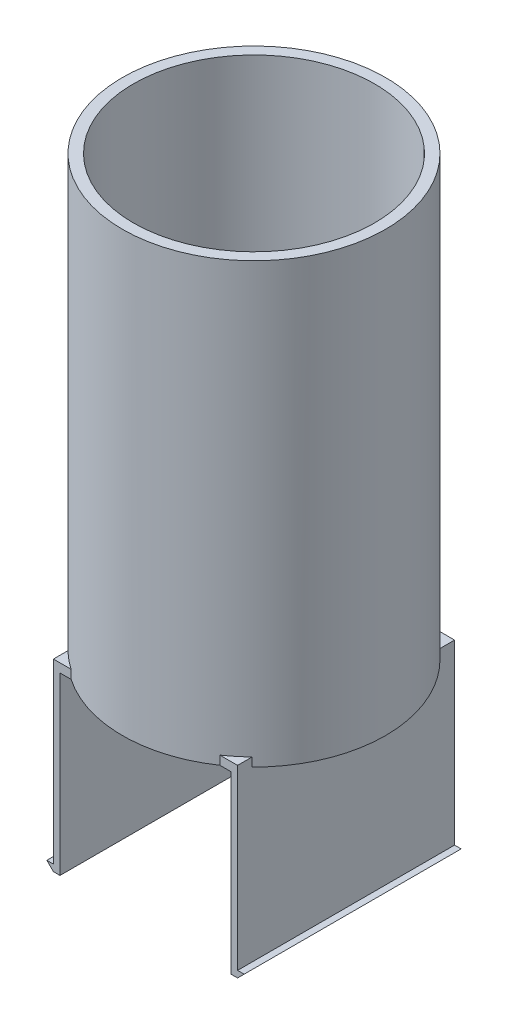
ISO-10303-21;
HEADER;
FILE_DESCRIPTION(('STEP AP214'),'2;1');
FILE_NAME('part.step','',(''),(''),'','','');
FILE_SCHEMA(('AUTOMOTIVE_DESIGN { 1 0 10303 214 1 1 1 1 }'));
ENDSEC;
DATA;
#1=APPLICATION_CONTEXT('core data for automotive mechanical design processes');
#2=APPLICATION_PROTOCOL_DEFINITION('international standard','automotive_design',2000,#1);
#3=PRODUCT_CONTEXT('',#1,'mechanical');
#4=PRODUCT('Part','Part','',(#3));
#5=PRODUCT_RELATED_PRODUCT_CATEGORY('part','',(#4));
#6=PRODUCT_DEFINITION_FORMATION('','',#4);
#7=PRODUCT_DEFINITION_CONTEXT('part definition',#1,'design');
#8=PRODUCT_DEFINITION('design','',#6,#7);
#9=PRODUCT_DEFINITION_SHAPE('','',#8);
#10=(LENGTH_UNIT() NAMED_UNIT(*) SI_UNIT(.MILLI.,.METRE.));
#11=(NAMED_UNIT(*) PLANE_ANGLE_UNIT() SI_UNIT($,.RADIAN.));
#12=(NAMED_UNIT(*) SI_UNIT($,.STERADIAN.) SOLID_ANGLE_UNIT());
#13=UNCERTAINTY_MEASURE_WITH_UNIT(LENGTH_MEASURE(1.E-05),#10,'distance_accuracy_value','');
#14=(GEOMETRIC_REPRESENTATION_CONTEXT(3) GLOBAL_UNCERTAINTY_ASSIGNED_CONTEXT((#13)) GLOBAL_UNIT_ASSIGNED_CONTEXT((#10,
#11,#12)) REPRESENTATION_CONTEXT('',''));
#15=CARTESIAN_POINT('',(0.,0.,0.));
#16=DIRECTION('',(0.,0.,1.));
#17=DIRECTION('',(1.,0.,0.));
#18=AXIS2_PLACEMENT_3D('',#15,#16,#17);
#19=CARTESIAN_POINT('',(0.,0.,0.));
#20=DIRECTION('',(0.,1.,0.));
#21=DIRECTION('',(0.,0.,1.));
#22=AXIS2_PLACEMENT_3D('',#19,#20,#21);
#23=PLANE('',#22);
#24=DIRECTION('',(0.,0.,1.));
#25=VECTOR('',#24,1.);
#26=CARTESIAN_POINT('',(21.,0.,24.75));
#27=LINE('',#26,#25);
#28=CARTESIAN_POINT('',(21.,0.,-21.4242852856285));
#29=VERTEX_POINT('',#28);
#30=CARTESIAN_POINT('',(21.,0.,21.4242852856286));
#31=VERTEX_POINT('',#30);
#32=EDGE_CURVE('E228',#29,#31,#27,.T.);
#33=ORIENTED_EDGE('',*,*,#32,.F.);
#34=CARTESIAN_POINT('',(0.,0.,0.));
#35=DIRECTION('',(0.,1.,0.));
#36=DIRECTION('',(0.,0.,1.));
#37=AXIS2_PLACEMENT_3D('',#34,#35,#36);
#38=CIRCLE('',#37,30.);
#39=EDGE_CURVE('E271',#31,#29,#38,.T.);
#40=ORIENTED_EDGE('',*,*,#39,.F.);
#41=EDGE_LOOP('',(#33,#40));
#42=FACE_BOUND('',#41,.T.);
#43=ADVANCED_FACE('F39',(#42),#23,.F.);
#44=CARTESIAN_POINT('',(-16.953981833186,0.,24.75));
#45=VERTEX_POINT('',#44);
#46=CARTESIAN_POINT('',(16.953981833186,0.,24.75));
#47=VERTEX_POINT('',#46);
#48=EDGE_CURVE('E272',#45,#47,#38,.T.);
#49=ORIENTED_EDGE('',*,*,#48,.F.);
#50=DIRECTION('',(-1.,0.,0.));
#51=VECTOR('',#50,1.);
#52=CARTESIAN_POINT('',(21.,0.,24.75));
#53=LINE('',#52,#51);
#54=CARTESIAN_POINT('',(-19.5,0.,24.75));
#55=VERTEX_POINT('',#54);
#56=EDGE_CURVE('E347',#45,#55,#53,.T.);
#57=ORIENTED_EDGE('',*,*,#56,.T.);
#58=DIRECTION('',(0.,0.,1.));
#59=VECTOR('',#58,1.);
#60=CARTESIAN_POINT('',(-19.5,0.,24.75));
#61=LINE('',#60,#59);
#62=CARTESIAN_POINT('',(-19.5,0.,-24.75));
#63=VERTEX_POINT('',#62);
#64=EDGE_CURVE('E77',#63,#55,#61,.T.);
#65=ORIENTED_EDGE('',*,*,#64,.F.);
#66=DIRECTION('',(1.,0.,0.));
#67=VECTOR('',#66,1.);
#68=CARTESIAN_POINT('',(21.,0.,-24.75));
#69=LINE('',#68,#67);
#70=CARTESIAN_POINT('',(-16.953981833186,0.,-24.75));
#71=VERTEX_POINT('',#70);
#72=EDGE_CURVE('E354',#63,#71,#69,.T.);
#73=ORIENTED_EDGE('',*,*,#72,.T.);
#74=CARTESIAN_POINT('',(16.953981833186,0.,-24.75));
#75=VERTEX_POINT('',#74);
#76=EDGE_CURVE('E265',#75,#71,#38,.T.);
#77=ORIENTED_EDGE('',*,*,#76,.F.);
#78=CARTESIAN_POINT('',(19.5,0.,-24.75));
#79=VERTEX_POINT('',#78);
#80=EDGE_CURVE('E351',#75,#79,#69,.T.);
#81=ORIENTED_EDGE('',*,*,#80,.T.);
#82=DIRECTION('',(0.,0.,-1.));
#83=VECTOR('',#82,1.);
#84=CARTESIAN_POINT('',(19.5,0.,24.75));
#85=LINE('',#84,#83);
#86=CARTESIAN_POINT('',(19.5,0.,24.75));
#87=VERTEX_POINT('',#86);
#88=EDGE_CURVE('E226',#87,#79,#85,.T.);
#89=ORIENTED_EDGE('',*,*,#88,.F.);
#90=EDGE_CURVE('E349',#87,#47,#53,.T.);
#91=ORIENTED_EDGE('',*,*,#90,.T.);
#92=EDGE_LOOP('',(#49,#57,#65,#73,#77,#81,#89,#91));
#93=FACE_BOUND('',#92,.T.);
#94=ADVANCED_FACE('F294',(#93),#23,.F.);
#95=DIRECTION('',(0.,0.,-1.));
#96=VECTOR('',#95,1.);
#97=CARTESIAN_POINT('',(-21.,0.,24.75));
#98=LINE('',#97,#96);
#99=CARTESIAN_POINT('',(-21.,0.,21.4242852856285));
#100=VERTEX_POINT('',#99);
#101=CARTESIAN_POINT('',(-21.,0.,-21.4242852856286));
#102=VERTEX_POINT('',#101);
#103=EDGE_CURVE('E250',#100,#102,#98,.T.);
#104=ORIENTED_EDGE('',*,*,#103,.F.);
#105=EDGE_CURVE('E269',#102,#100,#38,.T.);
#106=ORIENTED_EDGE('',*,*,#105,.F.);
#107=EDGE_LOOP('',(#104,#106));
#108=FACE_BOUND('',#107,.T.);
#109=ADVANCED_FACE('F286',(#108),#23,.F.);
#110=CARTESIAN_POINT('',(0.,100.,0.));
#111=DIRECTION('',(0.,1.,0.));
#112=DIRECTION('',(0.,0.,1.));
#113=AXIS2_PLACEMENT_3D('',#110,#111,#112);
#114=PLANE('',#113);
#115=CARTESIAN_POINT('',(0.,100.,0.));
#116=DIRECTION('',(0.,1.,0.));
#117=DIRECTION('',(0.,0.,1.));
#118=AXIS2_PLACEMENT_3D('',#115,#116,#117);
#119=CIRCLE('',#118,30.);
#120=CARTESIAN_POINT('',(0.,100.,30.));
#121=VERTEX_POINT('',#120);
#122=EDGE_CURVE('E266',#121,#121,#119,.T.);
#123=ORIENTED_EDGE('',*,*,#122,.T.);
#124=EDGE_LOOP('',(#123));
#125=FACE_BOUND('',#124,.T.);
#126=CARTESIAN_POINT('',(0.,100.,0.));
#127=DIRECTION('',(0.,1.,0.));
#128=DIRECTION('',(0.,0.,1.));
#129=AXIS2_PLACEMENT_3D('',#126,#127,#128);
#130=CIRCLE('',#129,27.5);
#131=CARTESIAN_POINT('',(0.,100.,27.5));
#132=VERTEX_POINT('',#131);
#133=EDGE_CURVE('E262',#132,#132,#130,.T.);
#134=ORIENTED_EDGE('',*,*,#133,.F.);
#135=EDGE_LOOP('',(#134));
#136=FACE_BOUND('',#135,.T.);
#137=ADVANCED_FACE('F284',(#125,#136),#114,.T.);
#138=CARTESIAN_POINT('',(0.,100.,0.));
#139=DIRECTION('',(0.,-1.,0.));
#140=DIRECTION('',(0.,0.,-1.));
#141=AXIS2_PLACEMENT_3D('',#138,#139,#140);
#142=CYLINDRICAL_SURFACE('',#141,30.);
#143=CARTESIAN_POINT('',(0.,2.,0.));
#144=DIRECTION('',(0.,1.,0.));
#145=DIRECTION('',(0.,0.,1.));
#146=AXIS2_PLACEMENT_3D('',#143,#144,#145);
#147=CIRCLE('',#146,30.);
#148=CARTESIAN_POINT('',(16.953981833186,2.,24.75));
#149=VERTEX_POINT('',#148);
#150=CARTESIAN_POINT('',(21.,2.,21.4242852856285));
#151=VERTEX_POINT('',#150);
#152=EDGE_CURVE('E11',#149,#151,#147,.T.);
#153=ORIENTED_EDGE('',*,*,#152,.T.);
#154=DIRECTION('',(0.,-1.,0.));
#155=VECTOR('',#154,1.);
#156=CARTESIAN_POINT('',(21.,100.,21.4242852856285));
#157=LINE('',#156,#155);
#158=EDGE_CURVE('E308',#151,#31,#157,.T.);
#159=ORIENTED_EDGE('',*,*,#158,.T.);
#160=ORIENTED_EDGE('',*,*,#39,.T.);
#161=DIRECTION('',(0.,-1.,0.));
#162=VECTOR('',#161,1.);
#163=CARTESIAN_POINT('',(21.,100.,-21.4242852856285));
#164=LINE('',#163,#162);
#165=CARTESIAN_POINT('',(21.,2.,-21.4242852856285));
#166=VERTEX_POINT('',#165);
#167=EDGE_CURVE('E307',#29,#166,#164,.F.);
#168=ORIENTED_EDGE('',*,*,#167,.T.);
#169=CARTESIAN_POINT('',(16.953981833186,2.,-24.75));
#170=VERTEX_POINT('',#169);
#171=EDGE_CURVE('E48',#166,#170,#147,.T.);
#172=ORIENTED_EDGE('',*,*,#171,.T.);
#173=DIRECTION('',(0.,-1.,0.));
#174=VECTOR('',#173,1.);
#175=CARTESIAN_POINT('',(16.953981833186,100.,-24.75));
#176=LINE('',#175,#174);
#177=EDGE_CURVE('E356',#170,#75,#176,.T.);
#178=ORIENTED_EDGE('',*,*,#177,.T.);
#179=ORIENTED_EDGE('',*,*,#76,.T.);
#180=DIRECTION('',(0.,-1.,0.));
#181=VECTOR('',#180,1.);
#182=CARTESIAN_POINT('',(-16.953981833186,100.,-24.75));
#183=LINE('',#182,#181);
#184=CARTESIAN_POINT('',(-16.953981833186,2.,-24.75));
#185=VERTEX_POINT('',#184);
#186=EDGE_CURVE('E329',#71,#185,#183,.F.);
#187=ORIENTED_EDGE('',*,*,#186,.T.);
#188=CARTESIAN_POINT('',(-21.,2.,-21.4242852856285));
#189=VERTEX_POINT('',#188);
#190=EDGE_CURVE('E322',#185,#189,#147,.T.);
#191=ORIENTED_EDGE('',*,*,#190,.T.);
#192=DIRECTION('',(0.,-1.,0.));
#193=VECTOR('',#192,1.);
#194=CARTESIAN_POINT('',(-21.,100.,-21.4242852856285));
#195=LINE('',#194,#193);
#196=EDGE_CURVE('E213',#189,#102,#195,.T.);
#197=ORIENTED_EDGE('',*,*,#196,.T.);
#198=ORIENTED_EDGE('',*,*,#105,.T.);
#199=DIRECTION('',(0.,-1.,0.));
#200=VECTOR('',#199,1.);
#201=CARTESIAN_POINT('',(-21.,100.,21.4242852856285));
#202=LINE('',#201,#200);
#203=CARTESIAN_POINT('',(-21.,2.,21.4242852856285));
#204=VERTEX_POINT('',#203);
#205=EDGE_CURVE('E55',#100,#204,#202,.F.);
#206=ORIENTED_EDGE('',*,*,#205,.T.);
#207=CARTESIAN_POINT('',(-16.953981833186,2.,24.75));
#208=VERTEX_POINT('',#207);
#209=EDGE_CURVE('E43',#204,#208,#147,.T.);
#210=ORIENTED_EDGE('',*,*,#209,.T.);
#211=DIRECTION('',(0.,-1.,0.));
#212=VECTOR('',#211,1.);
#213=CARTESIAN_POINT('',(-16.953981833186,100.,24.75));
#214=LINE('',#213,#212);
#215=EDGE_CURVE('E331',#208,#45,#214,.T.);
#216=ORIENTED_EDGE('',*,*,#215,.T.);
#217=ORIENTED_EDGE('',*,*,#48,.T.);
#218=DIRECTION('',(0.,-1.,0.));
#219=VECTOR('',#218,1.);
#220=CARTESIAN_POINT('',(16.953981833186,100.,24.75));
#221=LINE('',#220,#219);
#222=EDGE_CURVE('E361',#47,#149,#221,.F.);
#223=ORIENTED_EDGE('',*,*,#222,.T.);
#224=EDGE_LOOP('',(#153,#159,#160,#168,#172,#178,#179,#187,#191,#197,#198,#206,#210,#216,#217,#223));
#225=FACE_BOUND('',#224,.T.);
#226=ORIENTED_EDGE('',*,*,#122,.F.);
#227=EDGE_LOOP('',(#226));
#228=FACE_BOUND('',#227,.T.);
#229=ADVANCED_FACE('F41',(#225,#228),#142,.T.);
#230=CARTESIAN_POINT('',(0.,100.,0.));
#231=DIRECTION('',(0.,-1.,0.));
#232=DIRECTION('',(0.,0.,-1.));
#233=AXIS2_PLACEMENT_3D('',#230,#231,#232);
#234=CYLINDRICAL_SURFACE('',#233,27.5);
#235=CARTESIAN_POINT('',(0.,5.,0.));
#236=DIRECTION('',(0.,1.,0.));
#237=DIRECTION('',(0.,0.,1.));
#238=AXIS2_PLACEMENT_3D('',#235,#236,#237);
#239=CIRCLE('',#238,27.5);
#240=CARTESIAN_POINT('',(0.,5.,27.5));
#241=VERTEX_POINT('',#240);
#242=EDGE_CURVE('E252',#241,#241,#239,.T.);
#243=ORIENTED_EDGE('',*,*,#242,.F.);
#244=EDGE_LOOP('',(#243));
#245=FACE_BOUND('',#244,.T.);
#246=ORIENTED_EDGE('',*,*,#133,.T.);
#247=EDGE_LOOP('',(#246));
#248=FACE_BOUND('',#247,.T.);
#249=ADVANCED_FACE('F278',(#245,#248),#234,.F.);
#250=CARTESIAN_POINT('',(0.,5.,0.));
#251=DIRECTION('',(0.,1.,0.));
#252=DIRECTION('',(0.,0.,1.));
#253=AXIS2_PLACEMENT_3D('',#250,#251,#252);
#254=PLANE('',#253);
#255=ORIENTED_EDGE('',*,*,#242,.T.);
#256=EDGE_LOOP('',(#255));
#257=FACE_BOUND('',#256,.T.);
#258=ADVANCED_FACE('F276',(#257),#254,.T.);
#259=CARTESIAN_POINT('',(-19.5,-40.,24.75));
#260=DIRECTION('',(-1.,0.,0.));
#261=DIRECTION('',(0.,0.,1.));
#262=AXIS2_PLACEMENT_3D('',#259,#260,#261);
#263=PLANE('',#262);
#264=DIRECTION('',(0.,1.,0.));
#265=VECTOR('',#264,1.);
#266=CARTESIAN_POINT('',(-19.5,-40.,-24.75));
#267=LINE('',#266,#265);
#268=CARTESIAN_POINT('',(-19.5,-40.,-24.75));
#269=VERTEX_POINT('',#268);
#270=EDGE_CURVE('E248',#269,#63,#267,.T.);
#271=ORIENTED_EDGE('',*,*,#270,.T.);
#272=ORIENTED_EDGE('',*,*,#64,.T.);
#273=DIRECTION('',(0.,1.,0.));
#274=VECTOR('',#273,1.);
#275=CARTESIAN_POINT('',(-19.5,-40.,24.75));
#276=LINE('',#275,#274);
#277=CARTESIAN_POINT('',(-19.5,-40.,24.75));
#278=VERTEX_POINT('',#277);
#279=EDGE_CURVE('E259',#278,#55,#276,.T.);
#280=ORIENTED_EDGE('',*,*,#279,.F.);
#281=DIRECTION('',(0.,0.,1.));
#282=VECTOR('',#281,1.);
#283=CARTESIAN_POINT('',(-19.5,-40.,24.75));
#284=LINE('',#283,#282);
#285=EDGE_CURVE('E232',#269,#278,#284,.T.);
#286=ORIENTED_EDGE('',*,*,#285,.F.);
#287=EDGE_LOOP('',(#271,#272,#280,#286));
#288=FACE_BOUND('',#287,.T.);
#289=ADVANCED_FACE('F540',(#288),#263,.F.);
#290=CARTESIAN_POINT('',(-19.5,-40.,24.75));
#291=DIRECTION('',(0.,0.,-1.));
#292=DIRECTION('',(-1.,0.,0.));
#293=AXIS2_PLACEMENT_3D('',#290,#291,#292);
#294=PLANE('',#293);
#295=ORIENTED_EDGE('',*,*,#279,.T.);
#296=ORIENTED_EDGE('',*,*,#56,.F.);
#297=ORIENTED_EDGE('',*,*,#215,.F.);
#298=DIRECTION('',(-1.,0.,0.));
#299=VECTOR('',#298,1.);
#300=CARTESIAN_POINT('',(21.,2.,24.75));
#301=LINE('',#300,#299);
#302=CARTESIAN_POINT('',(-21.,2.,24.75));
#303=VERTEX_POINT('',#302);
#304=EDGE_CURVE('E338',#208,#303,#301,.T.);
#305=ORIENTED_EDGE('',*,*,#304,.T.);
#306=DIRECTION('',(0.,1.,0.));
#307=VECTOR('',#306,1.);
#308=CARTESIAN_POINT('',(-21.,-40.,24.75));
#309=LINE('',#308,#307);
#310=CARTESIAN_POINT('',(-21.,-38.5,24.75));
#311=VERTEX_POINT('',#310);
#312=EDGE_CURVE('E257',#311,#303,#309,.T.);
#313=ORIENTED_EDGE('',*,*,#312,.F.);
#314=DIRECTION('',(-1.,0.,0.));
#315=VECTOR('',#314,1.);
#316=CARTESIAN_POINT('',(-22.5,-38.5,24.75));
#317=LINE('',#316,#315);
#318=CARTESIAN_POINT('',(-22.5,-38.5,24.75));
#319=VERTEX_POINT('',#318);
#320=EDGE_CURVE('E386',#311,#319,#317,.T.);
#321=ORIENTED_EDGE('',*,*,#320,.T.);
#322=DIRECTION('',(0.707106781186546,-0.707106781186549,0.));
#323=VECTOR('',#322,1.);
#324=CARTESIAN_POINT('',(-21.,-40.,24.75));
#325=LINE('',#324,#323);
#326=CARTESIAN_POINT('',(-21.,-40.,24.75));
#327=VERTEX_POINT('',#326);
#328=EDGE_CURVE('E350',#319,#327,#325,.T.);
#329=ORIENTED_EDGE('',*,*,#328,.T.);
#330=DIRECTION('',(-1.,0.,0.));
#331=VECTOR('',#330,1.);
#332=CARTESIAN_POINT('',(-19.5,-40.,24.75));
#333=LINE('',#332,#331);
#334=EDGE_CURVE('E242',#278,#327,#333,.T.);
#335=ORIENTED_EDGE('',*,*,#334,.F.);
#336=EDGE_LOOP('',(#295,#296,#297,#305,#313,#321,#329,#335));
#337=FACE_BOUND('',#336,.T.);
#338=ADVANCED_FACE('F532',(#337),#294,.F.);
#339=CARTESIAN_POINT('',(-21.,-40.,24.75));
#340=DIRECTION('',(1.,0.,0.));
#341=DIRECTION('',(0.,0.,-1.));
#342=AXIS2_PLACEMENT_3D('',#339,#340,#341);
#343=PLANE('',#342);
#344=DIRECTION('',(0.,1.,0.));
#345=VECTOR('',#344,1.);
#346=CARTESIAN_POINT('',(-21.,-40.,-24.75));
#347=LINE('',#346,#345);
#348=CARTESIAN_POINT('',(-21.,-38.5,-24.75));
#349=VERTEX_POINT('',#348);
#350=CARTESIAN_POINT('',(-21.,2.,-24.75));
#351=VERTEX_POINT('',#350);
#352=EDGE_CURVE('E255',#349,#351,#347,.T.);
#353=ORIENTED_EDGE('',*,*,#352,.F.);
#354=DIRECTION('',(0.,0.,-1.));
#355=VECTOR('',#354,1.);
#356=CARTESIAN_POINT('',(-21.,-38.5,26.8713203435596));
#357=LINE('',#356,#355);
#358=EDGE_CURVE('E388',#311,#349,#357,.T.);
#359=ORIENTED_EDGE('',*,*,#358,.F.);
#360=ORIENTED_EDGE('',*,*,#312,.T.);
#361=DIRECTION('',(0.,0.,-1.));
#362=VECTOR('',#361,1.);
#363=CARTESIAN_POINT('',(-21.,2.,24.75));
#364=LINE('',#363,#362);
#365=EDGE_CURVE('E325',#303,#204,#364,.T.);
#366=ORIENTED_EDGE('',*,*,#365,.T.);
#367=ORIENTED_EDGE('',*,*,#205,.F.);
#368=ORIENTED_EDGE('',*,*,#103,.T.);
#369=ORIENTED_EDGE('',*,*,#196,.F.);
#370=EDGE_CURVE('E318',#189,#351,#364,.T.);
#371=ORIENTED_EDGE('',*,*,#370,.T.);
#372=EDGE_LOOP('',(#353,#359,#360,#366,#367,#368,#369,#371));
#373=FACE_BOUND('',#372,.T.);
#374=ADVANCED_FACE('F315',(#373),#343,.F.);
#375=CARTESIAN_POINT('',(-19.5,-40.,-24.75));
#376=DIRECTION('',(0.,0.,1.));
#377=DIRECTION('',(1.,0.,0.));
#378=AXIS2_PLACEMENT_3D('',#375,#376,#377);
#379=PLANE('',#378);
#380=DIRECTION('',(1.,0.,0.));
#381=VECTOR('',#380,1.);
#382=CARTESIAN_POINT('',(-19.5,-40.,-24.75));
#383=LINE('',#382,#381);
#384=CARTESIAN_POINT('',(-21.,-40.,-24.75));
#385=VERTEX_POINT('',#384);
#386=EDGE_CURVE('E64',#385,#269,#383,.T.);
#387=ORIENTED_EDGE('',*,*,#386,.F.);
#388=DIRECTION('',(-0.707106781186546,0.707106781186549,0.));
#389=VECTOR('',#388,1.);
#390=CARTESIAN_POINT('',(-21.,-40.,-24.75));
#391=LINE('',#390,#389);
#392=CARTESIAN_POINT('',(-22.5,-38.5,-24.75));
#393=VERTEX_POINT('',#392);
#394=EDGE_CURVE('E381',#385,#393,#391,.T.);
#395=ORIENTED_EDGE('',*,*,#394,.T.);
#396=DIRECTION('',(1.,0.,0.));
#397=VECTOR('',#396,1.);
#398=CARTESIAN_POINT('',(-22.5,-38.5,-24.75));
#399=LINE('',#398,#397);
#400=EDGE_CURVE('E391',#393,#349,#399,.T.);
#401=ORIENTED_EDGE('',*,*,#400,.T.);
#402=ORIENTED_EDGE('',*,*,#352,.T.);
#403=DIRECTION('',(1.,0.,0.));
#404=VECTOR('',#403,1.);
#405=CARTESIAN_POINT('',(21.,2.,-24.75));
#406=LINE('',#405,#404);
#407=EDGE_CURVE('E324',#351,#185,#406,.T.);
#408=ORIENTED_EDGE('',*,*,#407,.T.);
#409=ORIENTED_EDGE('',*,*,#186,.F.);
#410=ORIENTED_EDGE('',*,*,#72,.F.);
#411=ORIENTED_EDGE('',*,*,#270,.F.);
#412=EDGE_LOOP('',(#387,#395,#401,#402,#408,#409,#410,#411));
#413=FACE_BOUND('',#412,.T.);
#414=ADVANCED_FACE('F515',(#413),#379,.F.);
#415=CARTESIAN_POINT('',(0.,-40.,0.));
#416=DIRECTION('',(0.,1.,0.));
#417=DIRECTION('',(0.,0.,1.));
#418=AXIS2_PLACEMENT_3D('',#415,#416,#417);
#419=PLANE('',#418);
#420=ORIENTED_EDGE('',*,*,#285,.T.);
#421=ORIENTED_EDGE('',*,*,#334,.T.);
#422=DIRECTION('',(0.,0.,-1.));
#423=VECTOR('',#422,1.);
#424=CARTESIAN_POINT('',(-21.,-40.,24.75));
#425=LINE('',#424,#423);
#426=EDGE_CURVE('E245',#327,#385,#425,.T.);
#427=ORIENTED_EDGE('',*,*,#426,.T.);
#428=ORIENTED_EDGE('',*,*,#386,.T.);
#429=EDGE_LOOP('',(#420,#421,#427,#428));
#430=FACE_BOUND('',#429,.T.);
#431=ADVANCED_FACE('F507',(#430),#419,.F.);
#432=CARTESIAN_POINT('',(21.,-40.,24.75));
#433=DIRECTION('',(-1.,0.,0.));
#434=DIRECTION('',(0.,0.,1.));
#435=AXIS2_PLACEMENT_3D('',#432,#433,#434);
#436=PLANE('',#435);
#437=DIRECTION('',(0.,1.,0.));
#438=VECTOR('',#437,1.);
#439=CARTESIAN_POINT('',(21.,-40.,24.75));
#440=LINE('',#439,#438);
#441=CARTESIAN_POINT('',(21.,-38.5,24.75));
#442=VERTEX_POINT('',#441);
#443=CARTESIAN_POINT('',(21.,2.,24.75));
#444=VERTEX_POINT('',#443);
#445=EDGE_CURVE('E194',#442,#444,#440,.T.);
#446=ORIENTED_EDGE('',*,*,#445,.F.);
#447=DIRECTION('',(0.,0.,-1.));
#448=VECTOR('',#447,1.);
#449=CARTESIAN_POINT('',(21.,-38.5,26.8713203435596));
#450=LINE('',#449,#448);
#451=CARTESIAN_POINT('',(21.,-38.5,-24.75));
#452=VERTEX_POINT('',#451);
#453=EDGE_CURVE('E199',#442,#452,#450,.T.);
#454=ORIENTED_EDGE('',*,*,#453,.T.);
#455=DIRECTION('',(0.,1.,0.));
#456=VECTOR('',#455,1.);
#457=CARTESIAN_POINT('',(21.,-40.,-24.75));
#458=LINE('',#457,#456);
#459=CARTESIAN_POINT('',(21.,2.,-24.75));
#460=VERTEX_POINT('',#459);
#461=EDGE_CURVE('E223',#452,#460,#458,.T.);
#462=ORIENTED_EDGE('',*,*,#461,.T.);
#463=DIRECTION('',(0.,0.,1.));
#464=VECTOR('',#463,1.);
#465=CARTESIAN_POINT('',(21.,2.,24.75));
#466=LINE('',#465,#464);
#467=EDGE_CURVE('E397',#460,#166,#466,.T.);
#468=ORIENTED_EDGE('',*,*,#467,.T.);
#469=ORIENTED_EDGE('',*,*,#167,.F.);
#470=ORIENTED_EDGE('',*,*,#32,.T.);
#471=ORIENTED_EDGE('',*,*,#158,.F.);
#472=EDGE_CURVE('E210',#151,#444,#466,.T.);
#473=ORIENTED_EDGE('',*,*,#472,.T.);
#474=EDGE_LOOP('',(#446,#454,#462,#468,#469,#470,#471,#473));
#475=FACE_BOUND('',#474,.T.);
#476=ADVANCED_FACE('F208',(#475),#436,.F.);
#477=CARTESIAN_POINT('',(21.,-40.,24.75));
#478=DIRECTION('',(0.,0.,-1.));
#479=DIRECTION('',(-1.,0.,0.));
#480=AXIS2_PLACEMENT_3D('',#477,#478,#479);
#481=PLANE('',#480);
#482=DIRECTION('',(-1.,0.,0.));
#483=VECTOR('',#482,1.);
#484=CARTESIAN_POINT('',(21.,-40.,24.75));
#485=LINE('',#484,#483);
#486=CARTESIAN_POINT('',(21.,-40.,24.75));
#487=VERTEX_POINT('',#486);
#488=CARTESIAN_POINT('',(19.5,-40.,24.75));
#489=VERTEX_POINT('',#488);
#490=EDGE_CURVE('E237',#487,#489,#485,.T.);
#491=ORIENTED_EDGE('',*,*,#490,.F.);
#492=DIRECTION('',(0.707106781186544,0.707106781186551,0.));
#493=VECTOR('',#492,1.);
#494=CARTESIAN_POINT('',(21.,-40.,24.75));
#495=LINE('',#494,#493);
#496=CARTESIAN_POINT('',(22.5,-38.5,24.75));
#497=VERTEX_POINT('',#496);
#498=EDGE_CURVE('E87',#487,#497,#495,.T.);
#499=ORIENTED_EDGE('',*,*,#498,.T.);
#500=DIRECTION('',(-1.,0.,0.));
#501=VECTOR('',#500,1.);
#502=CARTESIAN_POINT('',(22.5,-38.5,24.75));
#503=LINE('',#502,#501);
#504=EDGE_CURVE('E189',#497,#442,#503,.T.);
#505=ORIENTED_EDGE('',*,*,#504,.T.);
#506=ORIENTED_EDGE('',*,*,#445,.T.);
#507=EDGE_CURVE('E326',#444,#149,#301,.T.);
#508=ORIENTED_EDGE('',*,*,#507,.T.);
#509=ORIENTED_EDGE('',*,*,#222,.F.);
#510=ORIENTED_EDGE('',*,*,#90,.F.);
#511=DIRECTION('',(0.,1.,0.));
#512=VECTOR('',#511,1.);
#513=CARTESIAN_POINT('',(19.5,-40.,24.75));
#514=LINE('',#513,#512);
#515=EDGE_CURVE('E212',#489,#87,#514,.T.);
#516=ORIENTED_EDGE('',*,*,#515,.F.);
#517=EDGE_LOOP('',(#491,#499,#505,#506,#508,#509,#510,#516));
#518=FACE_BOUND('',#517,.T.);
#519=ADVANCED_FACE('F191',(#518),#481,.F.);
#520=CARTESIAN_POINT('',(19.5,-40.,24.75));
#521=DIRECTION('',(1.,0.,0.));
#522=DIRECTION('',(0.,0.,-1.));
#523=AXIS2_PLACEMENT_3D('',#520,#521,#522);
#524=PLANE('',#523);
#525=ORIENTED_EDGE('',*,*,#88,.T.);
#526=DIRECTION('',(0.,1.,0.));
#527=VECTOR('',#526,1.);
#528=CARTESIAN_POINT('',(19.5,-40.,-24.75));
#529=LINE('',#528,#527);
#530=CARTESIAN_POINT('',(19.5,-40.,-24.75));
#531=VERTEX_POINT('',#530);
#532=EDGE_CURVE('E216',#531,#79,#529,.T.);
#533=ORIENTED_EDGE('',*,*,#532,.F.);
#534=DIRECTION('',(0.,0.,-1.));
#535=VECTOR('',#534,1.);
#536=CARTESIAN_POINT('',(19.5,-40.,24.75));
#537=LINE('',#536,#535);
#538=EDGE_CURVE('E235',#489,#531,#537,.T.);
#539=ORIENTED_EDGE('',*,*,#538,.F.);
#540=ORIENTED_EDGE('',*,*,#515,.T.);
#541=EDGE_LOOP('',(#525,#533,#539,#540));
#542=FACE_BOUND('',#541,.T.);
#543=ADVANCED_FACE('F370',(#542),#524,.F.);
#544=CARTESIAN_POINT('',(21.,-40.,-24.75));
#545=DIRECTION('',(0.,0.,1.));
#546=DIRECTION('',(1.,0.,0.));
#547=AXIS2_PLACEMENT_3D('',#544,#545,#546);
#548=PLANE('',#547);
#549=ORIENTED_EDGE('',*,*,#532,.T.);
#550=ORIENTED_EDGE('',*,*,#80,.F.);
#551=ORIENTED_EDGE('',*,*,#177,.F.);
#552=EDGE_CURVE('E341',#170,#460,#406,.T.);
#553=ORIENTED_EDGE('',*,*,#552,.T.);
#554=ORIENTED_EDGE('',*,*,#461,.F.);
#555=DIRECTION('',(1.,0.,0.));
#556=VECTOR('',#555,1.);
#557=CARTESIAN_POINT('',(22.5,-38.5,-24.75));
#558=LINE('',#557,#556);
#559=CARTESIAN_POINT('',(22.5,-38.5,-24.75));
#560=VERTEX_POINT('',#559);
#561=EDGE_CURVE('E202',#452,#560,#558,.T.);
#562=ORIENTED_EDGE('',*,*,#561,.T.);
#563=DIRECTION('',(-0.707106781186544,-0.707106781186551,0.));
#564=VECTOR('',#563,1.);
#565=CARTESIAN_POINT('',(21.,-40.,-24.75));
#566=LINE('',#565,#564);
#567=CARTESIAN_POINT('',(21.,-40.,-24.75));
#568=VERTEX_POINT('',#567);
#569=EDGE_CURVE('E205',#560,#568,#566,.T.);
#570=ORIENTED_EDGE('',*,*,#569,.T.);
#571=DIRECTION('',(1.,0.,0.));
#572=VECTOR('',#571,1.);
#573=CARTESIAN_POINT('',(21.,-40.,-24.75));
#574=LINE('',#573,#572);
#575=EDGE_CURVE('E225',#531,#568,#574,.T.);
#576=ORIENTED_EDGE('',*,*,#575,.F.);
#577=EDGE_LOOP('',(#549,#550,#551,#553,#554,#562,#570,#576));
#578=FACE_BOUND('',#577,.T.);
#579=ADVANCED_FACE('F379',(#578),#548,.F.);
#580=CARTESIAN_POINT('',(0.,-40.,0.));
#581=DIRECTION('',(0.,1.,0.));
#582=DIRECTION('',(0.,0.,1.));
#583=AXIS2_PLACEMENT_3D('',#580,#581,#582);
#584=PLANE('',#583);
#585=DIRECTION('',(0.,0.,1.));
#586=VECTOR('',#585,1.);
#587=CARTESIAN_POINT('',(21.,-40.,24.75));
#588=LINE('',#587,#586);
#589=EDGE_CURVE('E229',#568,#487,#588,.T.);
#590=ORIENTED_EDGE('',*,*,#589,.T.);
#591=ORIENTED_EDGE('',*,*,#490,.T.);
#592=ORIENTED_EDGE('',*,*,#538,.T.);
#593=ORIENTED_EDGE('',*,*,#575,.T.);
#594=EDGE_LOOP('',(#590,#591,#592,#593));
#595=FACE_BOUND('',#594,.T.);
#596=ADVANCED_FACE('F374',(#595),#584,.F.);
#597=CARTESIAN_POINT('',(0.,2.,0.));
#598=DIRECTION('',(0.,1.,0.));
#599=DIRECTION('',(0.,0.,1.));
#600=AXIS2_PLACEMENT_3D('',#597,#598,#599);
#601=PLANE('',#600);
#602=ORIENTED_EDGE('',*,*,#171,.F.);
#603=ORIENTED_EDGE('',*,*,#467,.F.);
#604=ORIENTED_EDGE('',*,*,#552,.F.);
#605=EDGE_LOOP('',(#602,#603,#604));
#606=FACE_BOUND('',#605,.T.);
#607=ADVANCED_FACE('F403',(#606),#601,.T.);
#608=ORIENTED_EDGE('',*,*,#152,.F.);
#609=ORIENTED_EDGE('',*,*,#507,.F.);
#610=ORIENTED_EDGE('',*,*,#472,.F.);
#611=EDGE_LOOP('',(#608,#609,#610));
#612=FACE_BOUND('',#611,.T.);
#613=ADVANCED_FACE('F405',(#612),#601,.T.);
#614=ORIENTED_EDGE('',*,*,#190,.F.);
#615=ORIENTED_EDGE('',*,*,#407,.F.);
#616=ORIENTED_EDGE('',*,*,#370,.F.);
#617=EDGE_LOOP('',(#614,#615,#616));
#618=FACE_BOUND('',#617,.T.);
#619=ADVANCED_FACE('F321',(#618),#601,.T.);
#620=ORIENTED_EDGE('',*,*,#209,.F.);
#621=ORIENTED_EDGE('',*,*,#365,.F.);
#622=ORIENTED_EDGE('',*,*,#304,.F.);
#623=EDGE_LOOP('',(#620,#621,#622));
#624=FACE_BOUND('',#623,.T.);
#625=ADVANCED_FACE('F336',(#624),#601,.T.);
#626=CARTESIAN_POINT('',(-22.5,-38.5,26.8713203435596));
#627=DIRECTION('',(0.,1.,0.));
#628=DIRECTION('',(0.,0.,1.));
#629=AXIS2_PLACEMENT_3D('',#626,#627,#628);
#630=PLANE('',#629);
#631=ORIENTED_EDGE('',*,*,#320,.F.);
#632=ORIENTED_EDGE('',*,*,#358,.T.);
#633=ORIENTED_EDGE('',*,*,#400,.F.);
#634=DIRECTION('',(0.,0.,-1.));
#635=VECTOR('',#634,1.);
#636=CARTESIAN_POINT('',(-22.5,-38.5,26.8713203435596));
#637=LINE('',#636,#635);
#638=EDGE_CURVE('E394',#319,#393,#637,.T.);
#639=ORIENTED_EDGE('',*,*,#638,.F.);
#640=EDGE_LOOP('',(#631,#632,#633,#639));
#641=FACE_BOUND('',#640,.T.);
#642=ADVANCED_FACE('F419',(#641),#630,.T.);
#643=CARTESIAN_POINT('',(-21.,-40.,26.8713203435596));
#644=DIRECTION('',(-0.707106781186549,-0.707106781186546,0.));
#645=DIRECTION('',(0.707106781186546,-0.707106781186549,0.));
#646=AXIS2_PLACEMENT_3D('',#643,#644,#645);
#647=PLANE('',#646);
#648=ORIENTED_EDGE('',*,*,#328,.F.);
#649=ORIENTED_EDGE('',*,*,#638,.T.);
#650=ORIENTED_EDGE('',*,*,#394,.F.);
#651=ORIENTED_EDGE('',*,*,#426,.F.);
#652=EDGE_LOOP('',(#648,#649,#650,#651));
#653=FACE_BOUND('',#652,.T.);
#654=ADVANCED_FACE('F423',(#653),#647,.T.);
#655=CARTESIAN_POINT('',(21.,-40.,26.8713203435596));
#656=DIRECTION('',(0.707106781186551,-0.707106781186544,0.));
#657=DIRECTION('',(0.707106781186544,0.707106781186551,0.));
#658=AXIS2_PLACEMENT_3D('',#655,#656,#657);
#659=PLANE('',#658);
#660=ORIENTED_EDGE('',*,*,#498,.F.);
#661=ORIENTED_EDGE('',*,*,#589,.F.);
#662=ORIENTED_EDGE('',*,*,#569,.F.);
#663=DIRECTION('',(0.,0.,-1.));
#664=VECTOR('',#663,1.);
#665=CARTESIAN_POINT('',(22.5,-38.5,26.8713203435596));
#666=LINE('',#665,#664);
#667=EDGE_CURVE('E206',#497,#560,#666,.T.);
#668=ORIENTED_EDGE('',*,*,#667,.F.);
#669=EDGE_LOOP('',(#660,#661,#662,#668));
#670=FACE_BOUND('',#669,.T.);
#671=ADVANCED_FACE('F377',(#670),#659,.T.);
#672=CARTESIAN_POINT('',(22.5,-38.5,26.8713203435596));
#673=DIRECTION('',(0.,1.,0.));
#674=DIRECTION('',(0.,0.,1.));
#675=AXIS2_PLACEMENT_3D('',#672,#673,#674);
#676=PLANE('',#675);
#677=ORIENTED_EDGE('',*,*,#504,.F.);
#678=ORIENTED_EDGE('',*,*,#667,.T.);
#679=ORIENTED_EDGE('',*,*,#561,.F.);
#680=ORIENTED_EDGE('',*,*,#453,.F.);
#681=EDGE_LOOP('',(#677,#678,#679,#680));
#682=FACE_BOUND('',#681,.T.);
#683=ADVANCED_FACE('F200',(#682),#676,.T.);
#684=CLOSED_SHELL('',(#43,#94,#109,#137,#229,#249,#258,#289,#338,#374,#414,#431,#476,#519,#543,
#579,#596,#607,#613,#619,#625,#642,#654,#671,#683));
#685=MANIFOLD_SOLID_BREP('B2',#684);
#686=ADVANCED_BREP_SHAPE_REPRESENTATION('',(#18,#685),#14);
#687=SHAPE_DEFINITION_REPRESENTATION(#9,#686);
ENDSEC;
END-ISO-10303-21;
